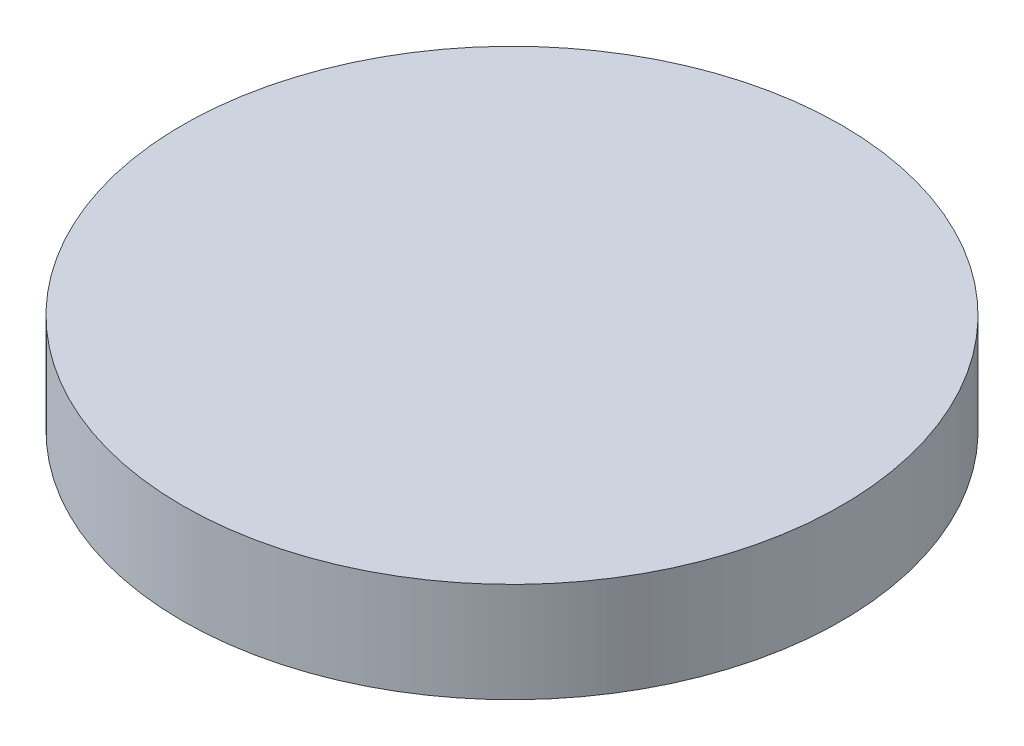
ISO-10303-21;
HEADER;
FILE_DESCRIPTION(('STEP AP214'),'2;1');
FILE_NAME('part.step','',(''),(''),'','','');
FILE_SCHEMA(('AUTOMOTIVE_DESIGN { 1 0 10303 214 1 1 1 1 }'));
ENDSEC;
DATA;
#1=APPLICATION_CONTEXT('core data for automotive mechanical design processes');
#2=APPLICATION_PROTOCOL_DEFINITION('international standard','automotive_design',2000,#1);
#3=PRODUCT_CONTEXT('',#1,'mechanical');
#4=PRODUCT('Part','Part','',(#3));
#5=PRODUCT_RELATED_PRODUCT_CATEGORY('part','',(#4));
#6=PRODUCT_DEFINITION_FORMATION('','',#4);
#7=PRODUCT_DEFINITION_CONTEXT('part definition',#1,'design');
#8=PRODUCT_DEFINITION('design','',#6,#7);
#9=PRODUCT_DEFINITION_SHAPE('','',#8);
#10=(LENGTH_UNIT() NAMED_UNIT(*) SI_UNIT(.MILLI.,.METRE.));
#11=(NAMED_UNIT(*) PLANE_ANGLE_UNIT() SI_UNIT($,.RADIAN.));
#12=(NAMED_UNIT(*) SI_UNIT($,.STERADIAN.) SOLID_ANGLE_UNIT());
#13=UNCERTAINTY_MEASURE_WITH_UNIT(LENGTH_MEASURE(1.E-05),#10,'distance_accuracy_value','');
#14=(GEOMETRIC_REPRESENTATION_CONTEXT(3) GLOBAL_UNCERTAINTY_ASSIGNED_CONTEXT((#13)) GLOBAL_UNIT_ASSIGNED_CONTEXT((#10,
#11,#12)) REPRESENTATION_CONTEXT('',''));
#15=CARTESIAN_POINT('',(0.,0.,0.));
#16=DIRECTION('',(0.,0.,1.));
#17=DIRECTION('',(1.,0.,0.));
#18=AXIS2_PLACEMENT_3D('',#15,#16,#17);
#19=CARTESIAN_POINT('',(0.,0.5,0.));
#20=DIRECTION('',(0.,-1.,0.));
#21=DIRECTION('',(0.,0.,-1.));
#22=AXIS2_PLACEMENT_3D('',#19,#20,#21);
#23=CYLINDRICAL_SURFACE('',#22,1.65);
#24=CARTESIAN_POINT('',(0.,0.5,0.));
#25=DIRECTION('',(0.,1.,0.));
#26=DIRECTION('',(0.,0.,1.));
#27=AXIS2_PLACEMENT_3D('',#24,#25,#26);
#28=CIRCLE('',#27,1.65);
#29=CARTESIAN_POINT('',(0.,0.5,1.65));
#30=VERTEX_POINT('',#29);
#31=EDGE_CURVE('E10',#30,#30,#28,.T.);
#32=ORIENTED_EDGE('',*,*,#31,.F.);
#33=EDGE_LOOP('',(#32));
#34=FACE_BOUND('',#33,.T.);
#35=CARTESIAN_POINT('',(0.,0.,0.));
#36=DIRECTION('',(0.,1.,0.));
#37=DIRECTION('',(0.,0.,1.));
#38=AXIS2_PLACEMENT_3D('',#35,#36,#37);
#39=CIRCLE('',#38,1.65);
#40=CARTESIAN_POINT('',(0.,0.,1.65));
#41=VERTEX_POINT('',#40);
#42=EDGE_CURVE('E34',#41,#41,#39,.T.);
#43=ORIENTED_EDGE('',*,*,#42,.T.);
#44=EDGE_LOOP('',(#43));
#45=FACE_BOUND('',#44,.T.);
#46=ADVANCED_FACE('F31',(#34,#45),#23,.T.);
#47=CARTESIAN_POINT('',(0.,0.5,0.));
#48=DIRECTION('',(0.,1.,0.));
#49=DIRECTION('',(0.,0.,1.));
#50=AXIS2_PLACEMENT_3D('',#47,#48,#49);
#51=PLANE('',#50);
#52=ORIENTED_EDGE('',*,*,#31,.T.);
#53=EDGE_LOOP('',(#52));
#54=FACE_BOUND('',#53,.T.);
#55=ADVANCED_FACE('F46',(#54),#51,.T.);
#56=CARTESIAN_POINT('',(0.,0.,0.));
#57=DIRECTION('',(0.,1.,0.));
#58=DIRECTION('',(0.,0.,1.));
#59=AXIS2_PLACEMENT_3D('',#56,#57,#58);
#60=PLANE('',#59);
#61=ORIENTED_EDGE('',*,*,#42,.F.);
#62=EDGE_LOOP('',(#61));
#63=FACE_BOUND('',#62,.T.);
#64=ADVANCED_FACE('F44',(#63),#60,.F.);
#65=CLOSED_SHELL('',(#46,#55,#64));
#66=MANIFOLD_SOLID_BREP('B2',#65);
#67=ADVANCED_BREP_SHAPE_REPRESENTATION('',(#18,#66),#14);
#68=SHAPE_DEFINITION_REPRESENTATION(#9,#67);
ENDSEC;
END-ISO-10303-21;
